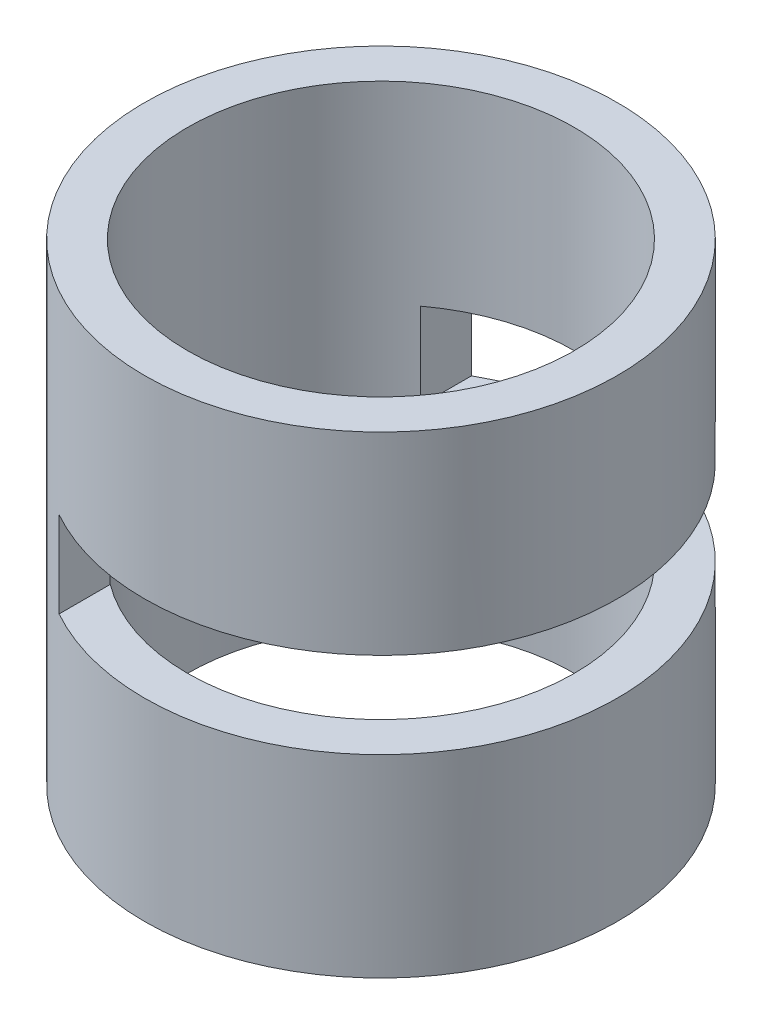
ISO-10303-21;
HEADER;
FILE_DESCRIPTION(('STEP AP214'),'2;1');
FILE_NAME('part.step','',(''),(''),'','','');
FILE_SCHEMA(('AUTOMOTIVE_DESIGN { 1 0 10303 214 1 1 1 1 }'));
ENDSEC;
DATA;
#1=APPLICATION_CONTEXT('core data for automotive mechanical design processes');
#2=APPLICATION_PROTOCOL_DEFINITION('international standard','automotive_design',2000,#1);
#3=PRODUCT_CONTEXT('',#1,'mechanical');
#4=PRODUCT('Part','Part','',(#3));
#5=PRODUCT_RELATED_PRODUCT_CATEGORY('part','',(#4));
#6=PRODUCT_DEFINITION_FORMATION('','',#4);
#7=PRODUCT_DEFINITION_CONTEXT('part definition',#1,'design');
#8=PRODUCT_DEFINITION('design','',#6,#7);
#9=PRODUCT_DEFINITION_SHAPE('','',#8);
#10=(LENGTH_UNIT() NAMED_UNIT(*) SI_UNIT(.MILLI.,.METRE.));
#11=(NAMED_UNIT(*) PLANE_ANGLE_UNIT() SI_UNIT($,.RADIAN.));
#12=(NAMED_UNIT(*) SI_UNIT($,.STERADIAN.) SOLID_ANGLE_UNIT());
#13=UNCERTAINTY_MEASURE_WITH_UNIT(LENGTH_MEASURE(1.E-05),#10,'distance_accuracy_value','');
#14=(GEOMETRIC_REPRESENTATION_CONTEXT(3) GLOBAL_UNCERTAINTY_ASSIGNED_CONTEXT((#13)) GLOBAL_UNIT_ASSIGNED_CONTEXT((#10,
#11,#12)) REPRESENTATION_CONTEXT('',''));
#15=CARTESIAN_POINT('',(0.,0.,0.));
#16=DIRECTION('',(0.,0.,1.));
#17=DIRECTION('',(1.,0.,0.));
#18=AXIS2_PLACEMENT_3D('',#15,#16,#17);
#19=CARTESIAN_POINT('',(0.,25.5104932202812,0.));
#20=DIRECTION('',(0.,1.,0.));
#21=DIRECTION('',(0.,0.,1.));
#22=AXIS2_PLACEMENT_3D('',#19,#20,#21);
#23=CYLINDRICAL_SURFACE('',#22,9.);
#24=DIRECTION('',(0.,1.,0.));
#25=VECTOR('',#24,1.);
#26=CARTESIAN_POINT('',(-5.38,25.5104932202812,-7.21495668732668));
#27=LINE('',#26,#25);
#28=CARTESIAN_POINT('',(-5.38,9.,-7.21495668732668));
#29=VERTEX_POINT('',#28);
#30=CARTESIAN_POINT('',(-5.38,13.,-7.21495668732668));
#31=VERTEX_POINT('',#30);
#32=EDGE_CURVE('E96',#29,#31,#27,.T.);
#33=ORIENTED_EDGE('',*,*,#32,.T.);
#34=CARTESIAN_POINT('',(0.,13.,0.));
#35=DIRECTION('',(0.,1.,0.));
#36=DIRECTION('',(0.,0.,1.));
#37=AXIS2_PLACEMENT_3D('',#34,#35,#36);
#38=CIRCLE('',#37,9.);
#39=CARTESIAN_POINT('',(-5.38,13.,7.21495668732668));
#40=VERTEX_POINT('',#39);
#41=EDGE_CURVE('E129',#31,#40,#38,.F.);
#42=ORIENTED_EDGE('',*,*,#41,.T.);
#43=DIRECTION('',(0.,1.,0.));
#44=VECTOR('',#43,1.);
#45=CARTESIAN_POINT('',(-5.38,25.5104932202812,7.21495668732668));
#46=LINE('',#45,#44);
#47=CARTESIAN_POINT('',(-5.38,9.,7.21495668732668));
#48=VERTEX_POINT('',#47);
#49=EDGE_CURVE('E123',#40,#48,#46,.F.);
#50=ORIENTED_EDGE('',*,*,#49,.T.);
#51=CARTESIAN_POINT('',(0.,9.,0.));
#52=DIRECTION('',(0.,-1.,0.));
#53=DIRECTION('',(0.,0.,-1.));
#54=AXIS2_PLACEMENT_3D('',#51,#52,#53);
#55=CIRCLE('',#54,9.);
#56=EDGE_CURVE('E133',#48,#29,#55,.F.);
#57=ORIENTED_EDGE('',*,*,#56,.T.);
#58=EDGE_LOOP('',(#33,#42,#50,#57));
#59=FACE_BOUND('',#58,.T.);
#60=CARTESIAN_POINT('',(0.,0.,0.));
#61=DIRECTION('',(0.,1.,0.));
#62=DIRECTION('',(0.,0.,1.));
#63=AXIS2_PLACEMENT_3D('',#60,#61,#62);
#64=CIRCLE('',#63,9.);
#65=CARTESIAN_POINT('',(0.,0.,9.));
#66=VERTEX_POINT('',#65);
#67=EDGE_CURVE('E89',#66,#66,#64,.T.);
#68=ORIENTED_EDGE('',*,*,#67,.F.);
#69=EDGE_LOOP('',(#68));
#70=FACE_BOUND('',#69,.T.);
#71=CARTESIAN_POINT('',(0.,22.,0.));
#72=DIRECTION('',(0.,1.,0.));
#73=DIRECTION('',(0.,0.,1.));
#74=AXIS2_PLACEMENT_3D('',#71,#72,#73);
#75=CIRCLE('',#74,9.);
#76=CARTESIAN_POINT('',(0.,22.,9.));
#77=VERTEX_POINT('',#76);
#78=EDGE_CURVE('E119',#77,#77,#75,.T.);
#79=ORIENTED_EDGE('',*,*,#78,.T.);
#80=EDGE_LOOP('',(#79));
#81=FACE_BOUND('',#80,.T.);
#82=ADVANCED_FACE('F41',(#59,#70,#81),#23,.F.);
#83=CARTESIAN_POINT('',(9.,0.,0.));
#84=DIRECTION('',(0.,1.,0.));
#85=DIRECTION('',(0.,0.,1.));
#86=AXIS2_PLACEMENT_3D('',#83,#84,#85);
#87=PLANE('',#86);
#88=CARTESIAN_POINT('',(0.,0.,0.));
#89=DIRECTION('',(0.,1.,0.));
#90=DIRECTION('',(0.,0.,1.));
#91=AXIS2_PLACEMENT_3D('',#88,#89,#90);
#92=CIRCLE('',#91,11.);
#93=CARTESIAN_POINT('',(0.,0.,11.));
#94=VERTEX_POINT('',#93);
#95=EDGE_CURVE('E111',#94,#94,#92,.T.);
#96=ORIENTED_EDGE('',*,*,#95,.F.);
#97=EDGE_LOOP('',(#96));
#98=FACE_BOUND('',#97,.T.);
#99=ORIENTED_EDGE('',*,*,#67,.T.);
#100=EDGE_LOOP('',(#99));
#101=FACE_BOUND('',#100,.T.);
#102=ADVANCED_FACE('F156',(#98,#101),#87,.F.);
#103=CARTESIAN_POINT('',(0.,25.5104932202812,0.));
#104=DIRECTION('',(0.,1.,0.));
#105=DIRECTION('',(0.,0.,1.));
#106=AXIS2_PLACEMENT_3D('',#103,#104,#105);
#107=CYLINDRICAL_SURFACE('',#106,11.);
#108=CARTESIAN_POINT('',(0.,13.,0.));
#109=DIRECTION('',(0.,1.,0.));
#110=DIRECTION('',(0.,0.,1.));
#111=AXIS2_PLACEMENT_3D('',#108,#109,#110);
#112=CIRCLE('',#111,11.);
#113=CARTESIAN_POINT('',(-5.38,13.,9.59456095921017));
#114=VERTEX_POINT('',#113);
#115=CARTESIAN_POINT('',(-5.38,13.,-9.59456095921017));
#116=VERTEX_POINT('',#115);
#117=EDGE_CURVE('E64',#114,#116,#112,.T.);
#118=ORIENTED_EDGE('',*,*,#117,.T.);
#119=DIRECTION('',(0.,1.,0.));
#120=VECTOR('',#119,1.);
#121=CARTESIAN_POINT('',(-5.38,25.5104932202812,-9.59456095921017));
#122=LINE('',#121,#120);
#123=CARTESIAN_POINT('',(-5.38,9.,-9.59456095921017));
#124=VERTEX_POINT('',#123);
#125=EDGE_CURVE('E11',#116,#124,#122,.F.);
#126=ORIENTED_EDGE('',*,*,#125,.T.);
#127=CARTESIAN_POINT('',(0.,9.,0.));
#128=DIRECTION('',(0.,-1.,0.));
#129=DIRECTION('',(0.,0.,-1.));
#130=AXIS2_PLACEMENT_3D('',#127,#128,#129);
#131=CIRCLE('',#130,11.);
#132=CARTESIAN_POINT('',(-5.38,9.,9.59456095921017));
#133=VERTEX_POINT('',#132);
#134=EDGE_CURVE('E82',#124,#133,#131,.T.);
#135=ORIENTED_EDGE('',*,*,#134,.T.);
#136=DIRECTION('',(0.,1.,0.));
#137=VECTOR('',#136,1.);
#138=CARTESIAN_POINT('',(-5.38,25.5104932202812,9.59456095921017));
#139=LINE('',#138,#137);
#140=EDGE_CURVE('E49',#133,#114,#139,.T.);
#141=ORIENTED_EDGE('',*,*,#140,.T.);
#142=EDGE_LOOP('',(#118,#126,#135,#141));
#143=FACE_BOUND('',#142,.T.);
#144=CARTESIAN_POINT('',(0.,22.,0.));
#145=DIRECTION('',(0.,1.,0.));
#146=DIRECTION('',(0.,0.,1.));
#147=AXIS2_PLACEMENT_3D('',#144,#145,#146);
#148=CIRCLE('',#147,11.);
#149=CARTESIAN_POINT('',(0.,22.,11.));
#150=VERTEX_POINT('',#149);
#151=EDGE_CURVE('E115',#150,#150,#148,.T.);
#152=ORIENTED_EDGE('',*,*,#151,.F.);
#153=EDGE_LOOP('',(#152));
#154=FACE_BOUND('',#153,.T.);
#155=ORIENTED_EDGE('',*,*,#95,.T.);
#156=EDGE_LOOP('',(#155));
#157=FACE_BOUND('',#156,.T.);
#158=ADVANCED_FACE('F101',(#143,#154,#157),#107,.T.);
#159=CARTESIAN_POINT('',(9.,22.,0.));
#160=DIRECTION('',(0.,-1.,0.));
#161=DIRECTION('',(0.,0.,-1.));
#162=AXIS2_PLACEMENT_3D('',#159,#160,#161);
#163=PLANE('',#162);
#164=ORIENTED_EDGE('',*,*,#78,.F.);
#165=EDGE_LOOP('',(#164));
#166=FACE_BOUND('',#165,.T.);
#167=ORIENTED_EDGE('',*,*,#151,.T.);
#168=EDGE_LOOP('',(#167));
#169=FACE_BOUND('',#168,.T.);
#170=ADVANCED_FACE('F164',(#166,#169),#163,.F.);
#171=CARTESIAN_POINT('',(-5.38,13.,-11.));
#172=DIRECTION('',(-1.,0.,0.));
#173=DIRECTION('',(0.,0.,1.));
#174=AXIS2_PLACEMENT_3D('',#171,#172,#173);
#175=PLANE('',#174);
#176=DIRECTION('',(0.,0.,1.));
#177=VECTOR('',#176,1.);
#178=CARTESIAN_POINT('',(-5.38,13.,-11.));
#179=LINE('',#178,#177);
#180=EDGE_CURVE('E99',#40,#114,#179,.T.);
#181=ORIENTED_EDGE('',*,*,#180,.T.);
#182=ORIENTED_EDGE('',*,*,#140,.F.);
#183=DIRECTION('',(0.,0.,1.));
#184=VECTOR('',#183,1.);
#185=CARTESIAN_POINT('',(-5.38,9.,-11.));
#186=LINE('',#185,#184);
#187=EDGE_CURVE('E85',#48,#133,#186,.T.);
#188=ORIENTED_EDGE('',*,*,#187,.F.);
#189=ORIENTED_EDGE('',*,*,#49,.F.);
#190=EDGE_LOOP('',(#181,#182,#188,#189));
#191=FACE_BOUND('',#190,.T.);
#192=ADVANCED_FACE('F145',(#191),#175,.F.);
#193=EDGE_CURVE('E56',#124,#29,#186,.T.);
#194=ORIENTED_EDGE('',*,*,#193,.F.);
#195=ORIENTED_EDGE('',*,*,#125,.F.);
#196=EDGE_CURVE('E135',#116,#31,#179,.T.);
#197=ORIENTED_EDGE('',*,*,#196,.T.);
#198=ORIENTED_EDGE('',*,*,#32,.F.);
#199=EDGE_LOOP('',(#194,#195,#197,#198));
#200=FACE_BOUND('',#199,.T.);
#201=ADVANCED_FACE('F93',(#200),#175,.F.);
#202=CARTESIAN_POINT('',(-5.38,13.,-11.));
#203=DIRECTION('',(0.,1.,0.));
#204=DIRECTION('',(0.,0.,1.));
#205=AXIS2_PLACEMENT_3D('',#202,#203,#204);
#206=PLANE('',#205);
#207=ORIENTED_EDGE('',*,*,#196,.F.);
#208=ORIENTED_EDGE('',*,*,#117,.F.);
#209=ORIENTED_EDGE('',*,*,#180,.F.);
#210=ORIENTED_EDGE('',*,*,#41,.F.);
#211=EDGE_LOOP('',(#207,#208,#209,#210));
#212=FACE_BOUND('',#211,.T.);
#213=ADVANCED_FACE('F146',(#212),#206,.F.);
#214=CARTESIAN_POINT('',(-5.38,9.,-11.));
#215=DIRECTION('',(0.,-1.,0.));
#216=DIRECTION('',(0.,0.,-1.));
#217=AXIS2_PLACEMENT_3D('',#214,#215,#216);
#218=PLANE('',#217);
#219=ORIENTED_EDGE('',*,*,#187,.T.);
#220=ORIENTED_EDGE('',*,*,#134,.F.);
#221=ORIENTED_EDGE('',*,*,#193,.T.);
#222=ORIENTED_EDGE('',*,*,#56,.F.);
#223=EDGE_LOOP('',(#219,#220,#221,#222));
#224=FACE_BOUND('',#223,.T.);
#225=ADVANCED_FACE('F83',(#224),#218,.F.);
#226=CLOSED_SHELL('',(#82,#102,#158,#170,#192,#201,#213,#225));
#227=MANIFOLD_SOLID_BREP('B2',#226);
#228=ADVANCED_BREP_SHAPE_REPRESENTATION('',(#18,#227),#14);
#229=SHAPE_DEFINITION_REPRESENTATION(#9,#228);
ENDSEC;
END-ISO-10303-21;
